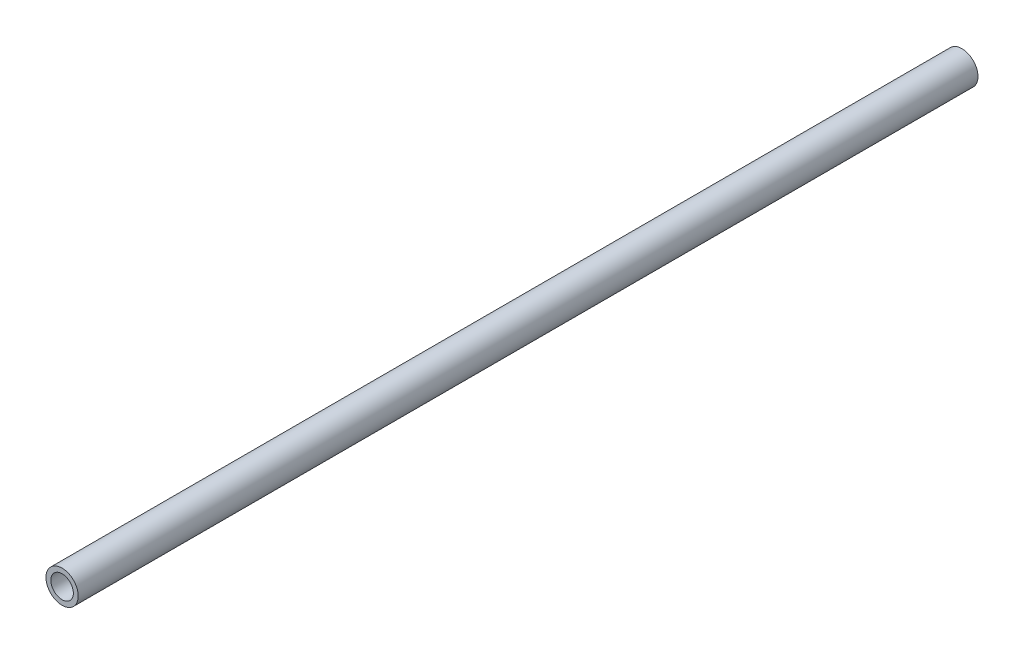
ISO-10303-21;
HEADER;
FILE_DESCRIPTION(('STEP AP214'),'2;1');
FILE_NAME('part.step','',(''),(''),'','','');
FILE_SCHEMA(('AUTOMOTIVE_DESIGN { 1 0 10303 214 1 1 1 1 }'));
ENDSEC;
DATA;
#1=APPLICATION_CONTEXT('core data for automotive mechanical design processes');
#2=APPLICATION_PROTOCOL_DEFINITION('international standard','automotive_design',2000,#1);
#3=PRODUCT_CONTEXT('',#1,'mechanical');
#4=PRODUCT('Part','Part','',(#3));
#5=PRODUCT_RELATED_PRODUCT_CATEGORY('part','',(#4));
#6=PRODUCT_DEFINITION_FORMATION('','',#4);
#7=PRODUCT_DEFINITION_CONTEXT('part definition',#1,'design');
#8=PRODUCT_DEFINITION('design','',#6,#7);
#9=PRODUCT_DEFINITION_SHAPE('','',#8);
#10=(LENGTH_UNIT() NAMED_UNIT(*) SI_UNIT(.MILLI.,.METRE.));
#11=(NAMED_UNIT(*) PLANE_ANGLE_UNIT() SI_UNIT($,.RADIAN.));
#12=(NAMED_UNIT(*) SI_UNIT($,.STERADIAN.) SOLID_ANGLE_UNIT());
#13=UNCERTAINTY_MEASURE_WITH_UNIT(LENGTH_MEASURE(1.E-05),#10,'distance_accuracy_value','');
#14=(GEOMETRIC_REPRESENTATION_CONTEXT(3) GLOBAL_UNCERTAINTY_ASSIGNED_CONTEXT((#13)) GLOBAL_UNIT_ASSIGNED_CONTEXT((#10,
#11,#12)) REPRESENTATION_CONTEXT('',''));
#15=CARTESIAN_POINT('',(0.,0.,0.));
#16=DIRECTION('',(0.,0.,1.));
#17=DIRECTION('',(1.,0.,0.));
#18=AXIS2_PLACEMENT_3D('',#15,#16,#17);
#19=CARTESIAN_POINT('',(0.,0.,600.));
#20=DIRECTION('',(0.,0.,1.));
#21=DIRECTION('',(1.,0.,0.));
#22=AXIS2_PLACEMENT_3D('',#19,#20,#21);
#23=PLANE('',#22);
#24=CARTESIAN_POINT('',(0.,0.,600.));
#25=DIRECTION('',(0.,0.,1.));
#26=DIRECTION('',(1.,0.,0.));
#27=AXIS2_PLACEMENT_3D('',#24,#25,#26);
#28=CIRCLE('',#27,10.75);
#29=CARTESIAN_POINT('',(10.75,0.,600.));
#30=VERTEX_POINT('',#29);
#31=EDGE_CURVE('E12',#30,#30,#28,.T.);
#32=ORIENTED_EDGE('',*,*,#31,.T.);
#33=EDGE_LOOP('',(#32));
#34=FACE_BOUND('',#33,.T.);
#35=CARTESIAN_POINT('',(0.,0.,600.));
#36=DIRECTION('',(0.,0.,1.));
#37=DIRECTION('',(1.,0.,0.));
#38=AXIS2_PLACEMENT_3D('',#35,#36,#37);
#39=CIRCLE('',#38,7.5);
#40=CARTESIAN_POINT('',(7.5,0.,600.));
#41=VERTEX_POINT('',#40);
#42=EDGE_CURVE('E62',#41,#41,#39,.T.);
#43=ORIENTED_EDGE('',*,*,#42,.F.);
#44=EDGE_LOOP('',(#43));
#45=FACE_BOUND('',#44,.T.);
#46=ADVANCED_FACE('F51',(#34,#45),#23,.T.);
#47=CARTESIAN_POINT('',(0.,0.,0.));
#48=DIRECTION('',(0.,0.,1.));
#49=DIRECTION('',(1.,0.,0.));
#50=AXIS2_PLACEMENT_3D('',#47,#48,#49);
#51=PLANE('',#50);
#52=CARTESIAN_POINT('',(0.,0.,0.));
#53=DIRECTION('',(0.,0.,1.));
#54=DIRECTION('',(1.,0.,0.));
#55=AXIS2_PLACEMENT_3D('',#52,#53,#54);
#56=CIRCLE('',#55,10.75);
#57=CARTESIAN_POINT('',(10.75,0.,0.));
#58=VERTEX_POINT('',#57);
#59=EDGE_CURVE('E55',#58,#58,#56,.T.);
#60=ORIENTED_EDGE('',*,*,#59,.F.);
#61=EDGE_LOOP('',(#60));
#62=FACE_BOUND('',#61,.T.);
#63=CARTESIAN_POINT('',(0.,0.,0.));
#64=DIRECTION('',(0.,0.,1.));
#65=DIRECTION('',(1.,0.,0.));
#66=AXIS2_PLACEMENT_3D('',#63,#64,#65);
#67=CIRCLE('',#66,7.5);
#68=CARTESIAN_POINT('',(7.5,0.,0.));
#69=VERTEX_POINT('',#68);
#70=EDGE_CURVE('E64',#69,#69,#67,.T.);
#71=ORIENTED_EDGE('',*,*,#70,.T.);
#72=EDGE_LOOP('',(#71));
#73=FACE_BOUND('',#72,.T.);
#74=ADVANCED_FACE('F74',(#62,#73),#51,.F.);
#75=CARTESIAN_POINT('',(0.,0.,600.));
#76=DIRECTION('',(0.,0.,-1.));
#77=DIRECTION('',(-1.,0.,0.));
#78=AXIS2_PLACEMENT_3D('',#75,#76,#77);
#79=CYLINDRICAL_SURFACE('',#78,10.75);
#80=ORIENTED_EDGE('',*,*,#31,.F.);
#81=EDGE_LOOP('',(#80));
#82=FACE_BOUND('',#81,.T.);
#83=ORIENTED_EDGE('',*,*,#59,.T.);
#84=EDGE_LOOP('',(#83));
#85=FACE_BOUND('',#84,.T.);
#86=ADVANCED_FACE('F53',(#82,#85),#79,.T.);
#87=CARTESIAN_POINT('',(0.,0.,600.));
#88=DIRECTION('',(0.,0.,-1.));
#89=DIRECTION('',(-1.,0.,0.));
#90=AXIS2_PLACEMENT_3D('',#87,#88,#89);
#91=CYLINDRICAL_SURFACE('',#90,7.5);
#92=ORIENTED_EDGE('',*,*,#42,.T.);
#93=EDGE_LOOP('',(#92));
#94=FACE_BOUND('',#93,.T.);
#95=ORIENTED_EDGE('',*,*,#70,.F.);
#96=EDGE_LOOP('',(#95));
#97=FACE_BOUND('',#96,.T.);
#98=ADVANCED_FACE('F70',(#94,#97),#91,.F.);
#99=CLOSED_SHELL('',(#46,#74,#86,#98));
#100=MANIFOLD_SOLID_BREP('B2',#99);
#101=ADVANCED_BREP_SHAPE_REPRESENTATION('',(#18,#100),#14);
#102=SHAPE_DEFINITION_REPRESENTATION(#9,#101);
ENDSEC;
END-ISO-10303-21;
